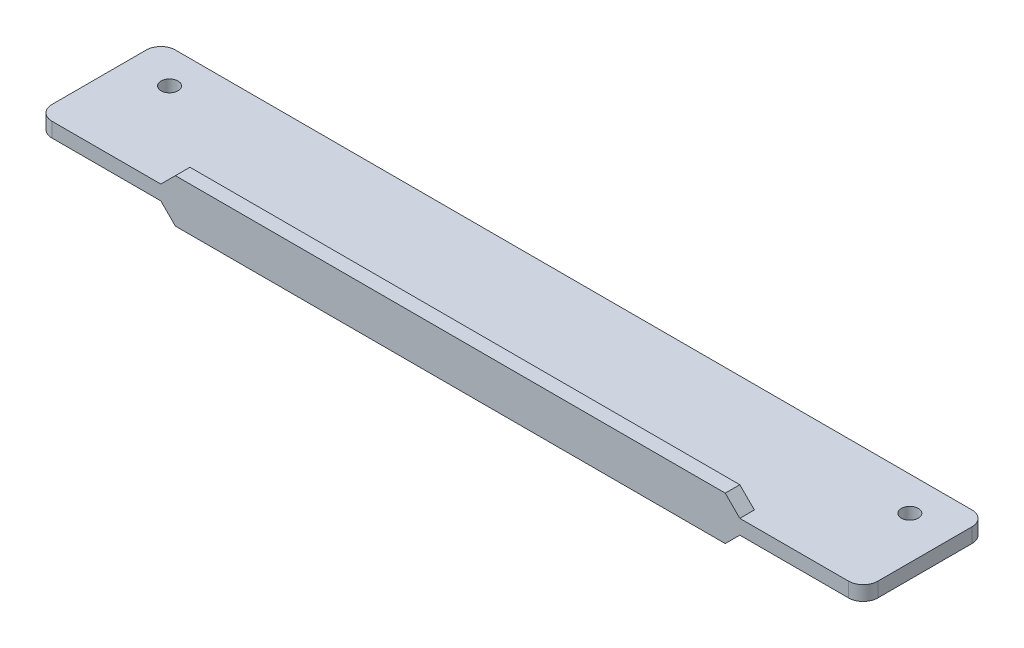
ISO-10303-21;
HEADER;
FILE_DESCRIPTION(('STEP AP214'),'2;1');
FILE_NAME('part.step','',(''),(''),'','','');
FILE_SCHEMA(('AUTOMOTIVE_DESIGN { 1 0 10303 214 1 1 1 1 }'));
ENDSEC;
DATA;
#1=APPLICATION_CONTEXT('core data for automotive mechanical design processes');
#2=APPLICATION_PROTOCOL_DEFINITION('international standard','automotive_design',2000,#1);
#3=PRODUCT_CONTEXT('',#1,'mechanical');
#4=PRODUCT('Part','Part','',(#3));
#5=PRODUCT_RELATED_PRODUCT_CATEGORY('part','',(#4));
#6=PRODUCT_DEFINITION_FORMATION('','',#4);
#7=PRODUCT_DEFINITION_CONTEXT('part definition',#1,'design');
#8=PRODUCT_DEFINITION('design','',#6,#7);
#9=PRODUCT_DEFINITION_SHAPE('','',#8);
#10=(LENGTH_UNIT() NAMED_UNIT(*) SI_UNIT(.MILLI.,.METRE.));
#11=(NAMED_UNIT(*) PLANE_ANGLE_UNIT() SI_UNIT($,.RADIAN.));
#12=(NAMED_UNIT(*) SI_UNIT($,.STERADIAN.) SOLID_ANGLE_UNIT());
#13=UNCERTAINTY_MEASURE_WITH_UNIT(LENGTH_MEASURE(1.E-05),#10,'distance_accuracy_value','');
#14=(GEOMETRIC_REPRESENTATION_CONTEXT(3) GLOBAL_UNCERTAINTY_ASSIGNED_CONTEXT((#13)) GLOBAL_UNIT_ASSIGNED_CONTEXT((#10,
#11,#12)) REPRESENTATION_CONTEXT('',''));
#15=CARTESIAN_POINT('',(0.,0.,0.));
#16=DIRECTION('',(0.,0.,1.));
#17=DIRECTION('',(1.,0.,0.));
#18=AXIS2_PLACEMENT_3D('',#15,#16,#17);
#19=CARTESIAN_POINT('',(-74.9462365591398,3.,-20.7168458781362));
#20=DIRECTION('',(1.,0.,0.));
#21=DIRECTION('',(0.,0.,-1.));
#22=AXIS2_PLACEMENT_3D('',#19,#20,#21);
#23=PLANE('',#22);
#24=DIRECTION('',(0.,0.,1.));
#25=VECTOR('',#24,1.);
#26=CARTESIAN_POINT('',(-74.9462365591398,3.,-20.7168458781362));
#27=LINE('',#26,#25);
#28=CARTESIAN_POINT('',(-74.9462365591398,3.,-17.7168458781362));
#29=VERTEX_POINT('',#28);
#30=CARTESIAN_POINT('',(-74.9462365591398,3.,1.6831541218638));
#31=VERTEX_POINT('',#30);
#32=EDGE_CURVE('E188',#29,#31,#27,.T.);
#33=ORIENTED_EDGE('',*,*,#32,.F.);
#34=DIRECTION('',(0.,-1.,0.));
#35=VECTOR('',#34,1.);
#36=CARTESIAN_POINT('',(-74.9462365591398,3.,-17.7168458781362));
#37=LINE('',#36,#35);
#38=CARTESIAN_POINT('',(-74.9462365591398,0.,-17.7168458781362));
#39=VERTEX_POINT('',#38);
#40=EDGE_CURVE('E223',#29,#39,#37,.T.);
#41=ORIENTED_EDGE('',*,*,#40,.T.);
#42=DIRECTION('',(0.,0.,1.));
#43=VECTOR('',#42,1.);
#44=CARTESIAN_POINT('',(-74.9462365591398,0.,-20.7168458781362));
#45=LINE('',#44,#43);
#46=CARTESIAN_POINT('',(-74.9462365591398,0.,1.6831541218638));
#47=VERTEX_POINT('',#46);
#48=EDGE_CURVE('E182',#39,#47,#45,.T.);
#49=ORIENTED_EDGE('',*,*,#48,.T.);
#50=DIRECTION('',(0.,-1.,0.));
#51=VECTOR('',#50,1.);
#52=CARTESIAN_POINT('',(-74.9462365591398,3.,1.6831541218638));
#53=LINE('',#52,#51);
#54=EDGE_CURVE('E221',#47,#31,#53,.F.);
#55=ORIENTED_EDGE('',*,*,#54,.T.);
#56=EDGE_LOOP('',(#33,#41,#49,#55));
#57=FACE_BOUND('',#56,.T.);
#58=ADVANCED_FACE('F35',(#57),#23,.F.);
#59=CARTESIAN_POINT('',(-74.9462365591398,3.,4.6831541218638));
#60=DIRECTION('',(0.,0.,-1.));
#61=DIRECTION('',(-1.,0.,0.));
#62=AXIS2_PLACEMENT_3D('',#59,#60,#61);
#63=PLANE('',#62);
#64=DIRECTION('',(1.,0.,0.));
#65=VECTOR('',#64,1.);
#66=CARTESIAN_POINT('',(-74.9462365591398,0.,4.6831541218638));
#67=LINE('',#66,#65);
#68=CARTESIAN_POINT('',(-71.9462365591398,0.,4.6831541218638));
#69=VERTEX_POINT('',#68);
#70=CARTESIAN_POINT('',(-49.5462365591398,0.,4.6831541218638));
#71=VERTEX_POINT('',#70);
#72=EDGE_CURVE('E165',#69,#71,#67,.T.);
#73=ORIENTED_EDGE('',*,*,#72,.T.);
#74=DIRECTION('',(-0.707106781186549,0.707106781186546,0.));
#75=VECTOR('',#74,1.);
#76=CARTESIAN_POINT('',(-49.5462365591398,0.,4.6831541218638));
#77=LINE('',#76,#75);
#78=CARTESIAN_POINT('',(-46.5462365591398,-3.,4.6831541218638));
#79=VERTEX_POINT('',#78);
#80=EDGE_CURVE('E148',#71,#79,#77,.F.);
#81=ORIENTED_EDGE('',*,*,#80,.T.);
#82=DIRECTION('',(1.,0.,0.));
#83=VECTOR('',#82,1.);
#84=CARTESIAN_POINT('',(-49.5462365591398,-3.,4.6831541218638));
#85=LINE('',#84,#83);
#86=CARTESIAN_POINT('',(66.6537634408602,-3.,4.6831541218638));
#87=VERTEX_POINT('',#86);
#88=EDGE_CURVE('E251',#79,#87,#85,.T.);
#89=ORIENTED_EDGE('',*,*,#88,.T.);
#90=DIRECTION('',(-0.707106781186546,-0.707106781186549,0.));
#91=VECTOR('',#90,1.);
#92=CARTESIAN_POINT('',(66.6537634408602,-3.,4.6831541218638));
#93=LINE('',#92,#91);
#94=CARTESIAN_POINT('',(69.6537634408602,0.,4.6831541218638));
#95=VERTEX_POINT('',#94);
#96=EDGE_CURVE('E159',#87,#95,#93,.F.);
#97=ORIENTED_EDGE('',*,*,#96,.T.);
#98=CARTESIAN_POINT('',(92.0537634408602,0.,4.6831541218638));
#99=VERTEX_POINT('',#98);
#100=EDGE_CURVE('E177',#95,#99,#67,.T.);
#101=ORIENTED_EDGE('',*,*,#100,.T.);
#102=DIRECTION('',(0.,-1.,0.));
#103=VECTOR('',#102,1.);
#104=CARTESIAN_POINT('',(92.0537634408602,3.,4.6831541218638));
#105=LINE('',#104,#103);
#106=CARTESIAN_POINT('',(92.0537634408602,3.,4.6831541218638));
#107=VERTEX_POINT('',#106);
#108=EDGE_CURVE('E218',#99,#107,#105,.F.);
#109=ORIENTED_EDGE('',*,*,#108,.T.);
#110=DIRECTION('',(1.,0.,0.));
#111=VECTOR('',#110,1.);
#112=CARTESIAN_POINT('',(-74.9462365591398,3.,4.6831541218638));
#113=LINE('',#112,#111);
#114=CARTESIAN_POINT('',(69.6537634408602,3.,4.6831541218638));
#115=VERTEX_POINT('',#114);
#116=EDGE_CURVE('E281',#115,#107,#113,.T.);
#117=ORIENTED_EDGE('',*,*,#116,.F.);
#118=DIRECTION('',(0.707106781186551,-0.707106781186544,0.));
#119=VECTOR('',#118,1.);
#120=CARTESIAN_POINT('',(69.6537634408602,3.,4.6831541218638));
#121=LINE('',#120,#119);
#122=CARTESIAN_POINT('',(66.6537634408602,6.,4.6831541218638));
#123=VERTEX_POINT('',#122);
#124=EDGE_CURVE('E229',#115,#123,#121,.F.);
#125=ORIENTED_EDGE('',*,*,#124,.T.);
#126=DIRECTION('',(-1.,0.,0.));
#127=VECTOR('',#126,1.);
#128=CARTESIAN_POINT('',(-49.5462365591398,6.,4.6831541218638));
#129=LINE('',#128,#127);
#130=CARTESIAN_POINT('',(-46.5462365591398,6.,4.6831541218638));
#131=VERTEX_POINT('',#130);
#132=EDGE_CURVE('E245',#123,#131,#129,.T.);
#133=ORIENTED_EDGE('',*,*,#132,.T.);
#134=DIRECTION('',(0.707106781186546,0.707106781186549,0.));
#135=VECTOR('',#134,1.);
#136=CARTESIAN_POINT('',(-46.5462365591398,6.,4.6831541218638));
#137=LINE('',#136,#135);
#138=CARTESIAN_POINT('',(-49.5462365591398,3.,4.6831541218638));
#139=VERTEX_POINT('',#138);
#140=EDGE_CURVE('E168',#131,#139,#137,.F.);
#141=ORIENTED_EDGE('',*,*,#140,.T.);
#142=CARTESIAN_POINT('',(-71.9462365591398,3.,4.6831541218638));
#143=VERTEX_POINT('',#142);
#144=EDGE_CURVE('E282',#143,#139,#113,.T.);
#145=ORIENTED_EDGE('',*,*,#144,.F.);
#146=DIRECTION('',(0.,-1.,0.));
#147=VECTOR('',#146,1.);
#148=CARTESIAN_POINT('',(-71.9462365591398,3.,4.6831541218638));
#149=LINE('',#148,#147);
#150=EDGE_CURVE('E175',#143,#69,#149,.T.);
#151=ORIENTED_EDGE('',*,*,#150,.T.);
#152=EDGE_LOOP('',(#73,#81,#89,#97,#101,#109,#117,#125,#133,#141,#145,#151));
#153=FACE_BOUND('',#152,.T.);
#154=ADVANCED_FACE('F172',(#153),#63,.F.);
#155=CARTESIAN_POINT('',(95.0537634408602,3.,-20.7168458781362));
#156=DIRECTION('',(-1.,0.,0.));
#157=DIRECTION('',(0.,0.,1.));
#158=AXIS2_PLACEMENT_3D('',#155,#156,#157);
#159=PLANE('',#158);
#160=DIRECTION('',(0.,0.,-1.));
#161=VECTOR('',#160,1.);
#162=CARTESIAN_POINT('',(95.0537634408602,0.,-20.7168458781362));
#163=LINE('',#162,#161);
#164=CARTESIAN_POINT('',(95.0537634408602,0.,1.68315412186381));
#165=VERTEX_POINT('',#164);
#166=CARTESIAN_POINT('',(95.0537634408602,0.,-17.7168458781362));
#167=VERTEX_POINT('',#166);
#168=EDGE_CURVE('E176',#165,#167,#163,.T.);
#169=ORIENTED_EDGE('',*,*,#168,.T.);
#170=DIRECTION('',(0.,-1.,0.));
#171=VECTOR('',#170,1.);
#172=CARTESIAN_POINT('',(95.0537634408602,3.,-17.7168458781362));
#173=LINE('',#172,#171);
#174=CARTESIAN_POINT('',(95.0537634408602,3.,-17.7168458781362));
#175=VERTEX_POINT('',#174);
#176=EDGE_CURVE('E207',#167,#175,#173,.F.);
#177=ORIENTED_EDGE('',*,*,#176,.T.);
#178=DIRECTION('',(0.,0.,-1.));
#179=VECTOR('',#178,1.);
#180=CARTESIAN_POINT('',(95.0537634408602,3.,-20.7168458781362));
#181=LINE('',#180,#179);
#182=CARTESIAN_POINT('',(95.0537634408602,3.,1.68315412186381));
#183=VERTEX_POINT('',#182);
#184=EDGE_CURVE('E284',#183,#175,#181,.T.);
#185=ORIENTED_EDGE('',*,*,#184,.F.);
#186=DIRECTION('',(0.,-1.,0.));
#187=VECTOR('',#186,1.);
#188=CARTESIAN_POINT('',(95.0537634408602,3.,1.68315412186381));
#189=LINE('',#188,#187);
#190=EDGE_CURVE('E204',#183,#165,#189,.T.);
#191=ORIENTED_EDGE('',*,*,#190,.T.);
#192=EDGE_LOOP('',(#169,#177,#185,#191));
#193=FACE_BOUND('',#192,.T.);
#194=ADVANCED_FACE('F320',(#193),#159,.F.);
#195=CARTESIAN_POINT('',(-74.9462365591398,3.,-20.7168458781362));
#196=DIRECTION('',(0.,0.,1.));
#197=DIRECTION('',(1.,0.,0.));
#198=AXIS2_PLACEMENT_3D('',#195,#196,#197);
#199=PLANE('',#198);
#200=DIRECTION('',(-1.,0.,0.));
#201=VECTOR('',#200,1.);
#202=CARTESIAN_POINT('',(-74.9462365591398,3.,-20.7168458781362));
#203=LINE('',#202,#201);
#204=CARTESIAN_POINT('',(92.0537634408602,3.,-20.7168458781362));
#205=VERTEX_POINT('',#204);
#206=CARTESIAN_POINT('',(-71.9462365591398,3.,-20.7168458781362));
#207=VERTEX_POINT('',#206);
#208=EDGE_CURVE('E192',#205,#207,#203,.T.);
#209=ORIENTED_EDGE('',*,*,#208,.F.);
#210=DIRECTION('',(0.,-1.,0.));
#211=VECTOR('',#210,1.);
#212=CARTESIAN_POINT('',(92.0537634408602,3.,-20.7168458781362));
#213=LINE('',#212,#211);
#214=CARTESIAN_POINT('',(92.0537634408602,0.,-20.7168458781362));
#215=VERTEX_POINT('',#214);
#216=EDGE_CURVE('E191',#205,#215,#213,.T.);
#217=ORIENTED_EDGE('',*,*,#216,.T.);
#218=DIRECTION('',(-1.,0.,0.));
#219=VECTOR('',#218,1.);
#220=CARTESIAN_POINT('',(-74.9462365591398,0.,-20.7168458781362));
#221=LINE('',#220,#219);
#222=CARTESIAN_POINT('',(-71.9462365591398,0.,-20.7168458781362));
#223=VERTEX_POINT('',#222);
#224=EDGE_CURVE('E180',#215,#223,#221,.T.);
#225=ORIENTED_EDGE('',*,*,#224,.T.);
#226=DIRECTION('',(0.,-1.,0.));
#227=VECTOR('',#226,1.);
#228=CARTESIAN_POINT('',(-71.9462365591398,3.,-20.7168458781362));
#229=LINE('',#228,#227);
#230=EDGE_CURVE('E189',#223,#207,#229,.F.);
#231=ORIENTED_EDGE('',*,*,#230,.T.);
#232=EDGE_LOOP('',(#209,#217,#225,#231));
#233=FACE_BOUND('',#232,.T.);
#234=ADVANCED_FACE('F382',(#233),#199,.F.);
#235=CARTESIAN_POINT('',(0.,3.,0.));
#236=DIRECTION('',(0.,1.,0.));
#237=DIRECTION('',(0.,0.,1.));
#238=AXIS2_PLACEMENT_3D('',#235,#236,#237);
#239=PLANE('',#238);
#240=DIRECTION('',(0.,0.,1.));
#241=VECTOR('',#240,1.);
#242=CARTESIAN_POINT('',(-49.5462365591398,3.,0.));
#243=LINE('',#242,#241);
#244=CARTESIAN_POINT('',(-49.5462365591398,3.,1.6831541218638));
#245=VERTEX_POINT('',#244);
#246=EDGE_CURVE('E264',#245,#139,#243,.T.);
#247=ORIENTED_EDGE('',*,*,#246,.F.);
#248=DIRECTION('',(1.,0.,0.));
#249=VECTOR('',#248,1.);
#250=CARTESIAN_POINT('',(0.,3.,1.6831541218638));
#251=LINE('',#250,#249);
#252=CARTESIAN_POINT('',(69.6537634408602,3.,1.6831541218638));
#253=VERTEX_POINT('',#252);
#254=EDGE_CURVE('E258',#245,#253,#251,.T.);
#255=ORIENTED_EDGE('',*,*,#254,.T.);
#256=DIRECTION('',(0.,0.,-1.));
#257=VECTOR('',#256,1.);
#258=CARTESIAN_POINT('',(69.6537634408602,3.,0.));
#259=LINE('',#258,#257);
#260=EDGE_CURVE('E261',#115,#253,#259,.T.);
#261=ORIENTED_EDGE('',*,*,#260,.F.);
#262=ORIENTED_EDGE('',*,*,#116,.T.);
#263=CARTESIAN_POINT('',(92.0537634408602,3.,1.6831541218638));
#264=DIRECTION('',(0.,1.,0.));
#265=DIRECTION('',(0.,0.,1.));
#266=AXIS2_PLACEMENT_3D('',#263,#264,#265);
#267=CIRCLE('',#266,3.);
#268=EDGE_CURVE('E213',#107,#183,#267,.T.);
#269=ORIENTED_EDGE('',*,*,#268,.T.);
#270=ORIENTED_EDGE('',*,*,#184,.T.);
#271=CARTESIAN_POINT('',(92.0537634408602,3.,-17.7168458781362));
#272=DIRECTION('',(0.,1.,0.));
#273=DIRECTION('',(0.,0.,1.));
#274=AXIS2_PLACEMENT_3D('',#271,#272,#273);
#275=CIRCLE('',#274,3.);
#276=EDGE_CURVE('E215',#175,#205,#275,.T.);
#277=ORIENTED_EDGE('',*,*,#276,.T.);
#278=ORIENTED_EDGE('',*,*,#208,.T.);
#279=CARTESIAN_POINT('',(-71.9462365591398,3.,-17.7168458781362));
#280=DIRECTION('',(0.,1.,0.));
#281=DIRECTION('',(0.,0.,1.));
#282=AXIS2_PLACEMENT_3D('',#279,#280,#281);
#283=CIRCLE('',#282,3.);
#284=EDGE_CURVE('E211',#207,#29,#283,.T.);
#285=ORIENTED_EDGE('',*,*,#284,.T.);
#286=ORIENTED_EDGE('',*,*,#32,.T.);
#287=CARTESIAN_POINT('',(-71.9462365591398,3.,1.6831541218638));
#288=DIRECTION('',(0.,1.,0.));
#289=DIRECTION('',(0.,0.,1.));
#290=AXIS2_PLACEMENT_3D('',#287,#288,#289);
#291=CIRCLE('',#290,3.);
#292=EDGE_CURVE('E209',#31,#143,#291,.T.);
#293=ORIENTED_EDGE('',*,*,#292,.T.);
#294=ORIENTED_EDGE('',*,*,#144,.T.);
#295=EDGE_LOOP('',(#247,#255,#261,#262,#269,#270,#277,#278,#285,#286,#293,#294));
#296=FACE_BOUND('',#295,.T.);
#297=CARTESIAN_POINT('',(-66.1462365591398,3.,-13.7168458781362));
#298=DIRECTION('',(0.,1.,0.));
#299=DIRECTION('',(0.,0.,1.));
#300=AXIS2_PLACEMENT_3D('',#297,#298,#299);
#301=CIRCLE('',#300,1.75);
#302=CARTESIAN_POINT('',(-66.1462365591398,3.,-11.9668458781362));
#303=VERTEX_POINT('',#302);
#304=EDGE_CURVE('E267',#303,#303,#301,.T.);
#305=ORIENTED_EDGE('',*,*,#304,.F.);
#306=EDGE_LOOP('',(#305));
#307=FACE_BOUND('',#306,.T.);
#308=CARTESIAN_POINT('',(86.2537634408602,3.,-13.7168458781362));
#309=DIRECTION('',(0.,1.,0.));
#310=DIRECTION('',(0.,0.,1.));
#311=AXIS2_PLACEMENT_3D('',#308,#309,#310);
#312=CIRCLE('',#311,1.75);
#313=CARTESIAN_POINT('',(86.2537634408602,3.,-11.9668458781362));
#314=VERTEX_POINT('',#313);
#315=EDGE_CURVE('E271',#314,#314,#312,.T.);
#316=ORIENTED_EDGE('',*,*,#315,.F.);
#317=EDGE_LOOP('',(#316));
#318=FACE_BOUND('',#317,.T.);
#319=ADVANCED_FACE('F290',(#296,#307,#318),#239,.T.);
#320=CARTESIAN_POINT('',(0.,0.,0.));
#321=DIRECTION('',(0.,1.,0.));
#322=DIRECTION('',(0.,0.,1.));
#323=AXIS2_PLACEMENT_3D('',#320,#321,#322);
#324=PLANE('',#323);
#325=CARTESIAN_POINT('',(-66.1462365591398,0.,-13.7168458781362));
#326=DIRECTION('',(0.,1.,0.));
#327=DIRECTION('',(0.,0.,1.));
#328=AXIS2_PLACEMENT_3D('',#325,#326,#327);
#329=CIRCLE('',#328,1.75);
#330=CARTESIAN_POINT('',(-66.1462365591398,0.,-11.9668458781362));
#331=VERTEX_POINT('',#330);
#332=EDGE_CURVE('E268',#331,#331,#329,.T.);
#333=ORIENTED_EDGE('',*,*,#332,.T.);
#334=EDGE_LOOP('',(#333));
#335=FACE_BOUND('',#334,.T.);
#336=CARTESIAN_POINT('',(86.2537634408602,0.,-13.7168458781362));
#337=DIRECTION('',(0.,1.,0.));
#338=DIRECTION('',(0.,0.,1.));
#339=AXIS2_PLACEMENT_3D('',#336,#337,#338);
#340=CIRCLE('',#339,1.75);
#341=CARTESIAN_POINT('',(86.2537634408602,0.,-11.9668458781362));
#342=VERTEX_POINT('',#341);
#343=EDGE_CURVE('E274',#342,#342,#340,.T.);
#344=ORIENTED_EDGE('',*,*,#343,.T.);
#345=EDGE_LOOP('',(#344));
#346=FACE_BOUND('',#345,.T.);
#347=DIRECTION('',(1.,0.,0.));
#348=VECTOR('',#347,1.);
#349=CARTESIAN_POINT('',(0.,0.,1.6831541218638));
#350=LINE('',#349,#348);
#351=CARTESIAN_POINT('',(-49.5462365591398,0.,1.6831541218638));
#352=VERTEX_POINT('',#351);
#353=CARTESIAN_POINT('',(69.6537634408602,0.,1.6831541218638));
#354=VERTEX_POINT('',#353);
#355=EDGE_CURVE('E167',#352,#354,#350,.T.);
#356=ORIENTED_EDGE('',*,*,#355,.F.);
#357=DIRECTION('',(0.,0.,1.));
#358=VECTOR('',#357,1.);
#359=CARTESIAN_POINT('',(-49.5462365591398,0.,0.));
#360=LINE('',#359,#358);
#361=EDGE_CURVE('E152',#352,#71,#360,.T.);
#362=ORIENTED_EDGE('',*,*,#361,.T.);
#363=ORIENTED_EDGE('',*,*,#72,.F.);
#364=CARTESIAN_POINT('',(-71.9462365591398,0.,1.6831541218638));
#365=DIRECTION('',(0.,1.,0.));
#366=DIRECTION('',(0.,0.,1.));
#367=AXIS2_PLACEMENT_3D('',#364,#365,#366);
#368=CIRCLE('',#367,3.);
#369=EDGE_CURVE('E195',#69,#47,#368,.F.);
#370=ORIENTED_EDGE('',*,*,#369,.T.);
#371=ORIENTED_EDGE('',*,*,#48,.F.);
#372=CARTESIAN_POINT('',(-71.9462365591398,0.,-17.7168458781362));
#373=DIRECTION('',(0.,1.,0.));
#374=DIRECTION('',(0.,0.,1.));
#375=AXIS2_PLACEMENT_3D('',#372,#373,#374);
#376=CIRCLE('',#375,3.);
#377=EDGE_CURVE('E197',#39,#223,#376,.F.);
#378=ORIENTED_EDGE('',*,*,#377,.T.);
#379=ORIENTED_EDGE('',*,*,#224,.F.);
#380=CARTESIAN_POINT('',(92.0537634408602,0.,-17.7168458781362));
#381=DIRECTION('',(0.,1.,0.));
#382=DIRECTION('',(0.,0.,1.));
#383=AXIS2_PLACEMENT_3D('',#380,#381,#382);
#384=CIRCLE('',#383,3.);
#385=EDGE_CURVE('E202',#215,#167,#384,.F.);
#386=ORIENTED_EDGE('',*,*,#385,.T.);
#387=ORIENTED_EDGE('',*,*,#168,.F.);
#388=CARTESIAN_POINT('',(92.0537634408602,0.,1.6831541218638));
#389=DIRECTION('',(0.,1.,0.));
#390=DIRECTION('',(0.,0.,1.));
#391=AXIS2_PLACEMENT_3D('',#388,#389,#390);
#392=CIRCLE('',#391,3.);
#393=EDGE_CURVE('E199',#165,#99,#392,.F.);
#394=ORIENTED_EDGE('',*,*,#393,.T.);
#395=ORIENTED_EDGE('',*,*,#100,.F.);
#396=DIRECTION('',(0.,0.,-1.));
#397=VECTOR('',#396,1.);
#398=CARTESIAN_POINT('',(69.6537634408602,0.,0.));
#399=LINE('',#398,#397);
#400=EDGE_CURVE('E169',#95,#354,#399,.T.);
#401=ORIENTED_EDGE('',*,*,#400,.T.);
#402=EDGE_LOOP('',(#356,#362,#363,#370,#371,#378,#379,#386,#387,#394,#395,#401));
#403=FACE_BOUND('',#402,.T.);
#404=ADVANCED_FACE('F164',(#335,#346,#403),#324,.F.);
#405=CARTESIAN_POINT('',(92.0537634408602,3.,-17.7168458781362));
#406=DIRECTION('',(0.,-1.,0.));
#407=DIRECTION('',(0.,0.,-1.));
#408=AXIS2_PLACEMENT_3D('',#405,#406,#407);
#409=CYLINDRICAL_SURFACE('',#408,3.);
#410=ORIENTED_EDGE('',*,*,#276,.F.);
#411=ORIENTED_EDGE('',*,*,#176,.F.);
#412=ORIENTED_EDGE('',*,*,#385,.F.);
#413=ORIENTED_EDGE('',*,*,#216,.F.);
#414=EDGE_LOOP('',(#410,#411,#412,#413));
#415=FACE_BOUND('',#414,.T.);
#416=ADVANCED_FACE('F324',(#415),#409,.T.);
#417=CARTESIAN_POINT('',(92.0537634408602,3.,1.6831541218638));
#418=DIRECTION('',(0.,-1.,0.));
#419=DIRECTION('',(0.,0.,-1.));
#420=AXIS2_PLACEMENT_3D('',#417,#418,#419);
#421=CYLINDRICAL_SURFACE('',#420,3.);
#422=ORIENTED_EDGE('',*,*,#268,.F.);
#423=ORIENTED_EDGE('',*,*,#108,.F.);
#424=ORIENTED_EDGE('',*,*,#393,.F.);
#425=ORIENTED_EDGE('',*,*,#190,.F.);
#426=EDGE_LOOP('',(#422,#423,#424,#425));
#427=FACE_BOUND('',#426,.T.);
#428=ADVANCED_FACE('F327',(#427),#421,.T.);
#429=CARTESIAN_POINT('',(-71.9462365591398,3.,-17.7168458781362));
#430=DIRECTION('',(0.,-1.,0.));
#431=DIRECTION('',(0.,0.,-1.));
#432=AXIS2_PLACEMENT_3D('',#429,#430,#431);
#433=CYLINDRICAL_SURFACE('',#432,3.);
#434=ORIENTED_EDGE('',*,*,#284,.F.);
#435=ORIENTED_EDGE('',*,*,#230,.F.);
#436=ORIENTED_EDGE('',*,*,#377,.F.);
#437=ORIENTED_EDGE('',*,*,#40,.F.);
#438=EDGE_LOOP('',(#434,#435,#436,#437));
#439=FACE_BOUND('',#438,.T.);
#440=ADVANCED_FACE('F299',(#439),#433,.T.);
#441=CARTESIAN_POINT('',(-71.9462365591398,3.,1.6831541218638));
#442=DIRECTION('',(0.,-1.,0.));
#443=DIRECTION('',(0.,0.,-1.));
#444=AXIS2_PLACEMENT_3D('',#441,#442,#443);
#445=CYLINDRICAL_SURFACE('',#444,3.);
#446=ORIENTED_EDGE('',*,*,#292,.F.);
#447=ORIENTED_EDGE('',*,*,#54,.F.);
#448=ORIENTED_EDGE('',*,*,#369,.F.);
#449=ORIENTED_EDGE('',*,*,#150,.F.);
#450=EDGE_LOOP('',(#446,#447,#448,#449));
#451=FACE_BOUND('',#450,.T.);
#452=ADVANCED_FACE('F307',(#451),#445,.T.);
#453=CARTESIAN_POINT('',(86.2537634408602,0.,-13.7168458781362));
#454=DIRECTION('',(0.,1.,0.));
#455=DIRECTION('',(0.,0.,1.));
#456=AXIS2_PLACEMENT_3D('',#453,#454,#455);
#457=CYLINDRICAL_SURFACE('',#456,1.75);
#458=ORIENTED_EDGE('',*,*,#343,.F.);
#459=EDGE_LOOP('',(#458));
#460=FACE_BOUND('',#459,.T.);
#461=ORIENTED_EDGE('',*,*,#315,.T.);
#462=EDGE_LOOP('',(#461));
#463=FACE_BOUND('',#462,.T.);
#464=ADVANCED_FACE('F336',(#460,#463),#457,.F.);
#465=CARTESIAN_POINT('',(-66.1462365591398,0.,-13.7168458781362));
#466=DIRECTION('',(0.,1.,0.));
#467=DIRECTION('',(0.,0.,1.));
#468=AXIS2_PLACEMENT_3D('',#465,#466,#467);
#469=CYLINDRICAL_SURFACE('',#468,1.75);
#470=ORIENTED_EDGE('',*,*,#332,.F.);
#471=EDGE_LOOP('',(#470));
#472=FACE_BOUND('',#471,.T.);
#473=ORIENTED_EDGE('',*,*,#304,.T.);
#474=EDGE_LOOP('',(#473));
#475=FACE_BOUND('',#474,.T.);
#476=ADVANCED_FACE('F369',(#472,#475),#469,.F.);
#477=CARTESIAN_POINT('',(-49.5462365591398,-3.,1.6831541218638));
#478=DIRECTION('',(0.,-1.,0.));
#479=DIRECTION('',(0.,0.,-1.));
#480=AXIS2_PLACEMENT_3D('',#477,#478,#479);
#481=PLANE('',#480);
#482=ORIENTED_EDGE('',*,*,#88,.F.);
#483=DIRECTION('',(0.,0.,-1.));
#484=VECTOR('',#483,1.);
#485=CARTESIAN_POINT('',(-46.5462365591398,-3.,1.6831541218638));
#486=LINE('',#485,#484);
#487=CARTESIAN_POINT('',(-46.5462365591398,-3.,1.6831541218638));
#488=VERTEX_POINT('',#487);
#489=EDGE_CURVE('E153',#79,#488,#486,.T.);
#490=ORIENTED_EDGE('',*,*,#489,.T.);
#491=DIRECTION('',(1.,0.,0.));
#492=VECTOR('',#491,1.);
#493=CARTESIAN_POINT('',(-49.5462365591398,-3.,1.6831541218638));
#494=LINE('',#493,#492);
#495=CARTESIAN_POINT('',(66.6537634408602,-3.,1.6831541218638));
#496=VERTEX_POINT('',#495);
#497=EDGE_CURVE('E250',#488,#496,#494,.T.);
#498=ORIENTED_EDGE('',*,*,#497,.T.);
#499=DIRECTION('',(0.,0.,1.));
#500=VECTOR('',#499,1.);
#501=CARTESIAN_POINT('',(66.6537634408602,-3.,1.6831541218638));
#502=LINE('',#501,#500);
#503=EDGE_CURVE('E158',#496,#87,#502,.T.);
#504=ORIENTED_EDGE('',*,*,#503,.T.);
#505=EDGE_LOOP('',(#482,#490,#498,#504));
#506=FACE_BOUND('',#505,.T.);
#507=ADVANCED_FACE('F351',(#506),#481,.T.);
#508=CARTESIAN_POINT('',(0.,0.,1.6831541218638));
#509=DIRECTION('',(0.,0.,1.));
#510=DIRECTION('',(1.,0.,0.));
#511=AXIS2_PLACEMENT_3D('',#508,#509,#510);
#512=PLANE('',#511);
#513=ORIENTED_EDGE('',*,*,#497,.F.);
#514=DIRECTION('',(0.707106781186549,-0.707106781186546,0.));
#515=VECTOR('',#514,1.);
#516=CARTESIAN_POINT('',(-49.5462365591398,0.,1.6831541218638));
#517=LINE('',#516,#515);
#518=EDGE_CURVE('E237',#488,#352,#517,.F.);
#519=ORIENTED_EDGE('',*,*,#518,.T.);
#520=ORIENTED_EDGE('',*,*,#355,.T.);
#521=DIRECTION('',(0.707106781186546,0.707106781186549,0.));
#522=VECTOR('',#521,1.);
#523=CARTESIAN_POINT('',(66.6537634408602,-3.,1.6831541218638));
#524=LINE('',#523,#522);
#525=EDGE_CURVE('E235',#354,#496,#524,.F.);
#526=ORIENTED_EDGE('',*,*,#525,.T.);
#527=EDGE_LOOP('',(#513,#519,#520,#526));
#528=FACE_BOUND('',#527,.T.);
#529=ADVANCED_FACE('F349',(#528),#512,.F.);
#530=CARTESIAN_POINT('',(-49.5462365591398,6.,1.6831541218638));
#531=DIRECTION('',(0.,1.,0.));
#532=DIRECTION('',(0.,0.,1.));
#533=AXIS2_PLACEMENT_3D('',#530,#531,#532);
#534=PLANE('',#533);
#535=ORIENTED_EDGE('',*,*,#132,.F.);
#536=DIRECTION('',(0.,0.,-1.));
#537=VECTOR('',#536,1.);
#538=CARTESIAN_POINT('',(66.6537634408602,6.,1.6831541218638));
#539=LINE('',#538,#537);
#540=CARTESIAN_POINT('',(66.6537634408602,6.,1.6831541218638));
#541=VERTEX_POINT('',#540);
#542=EDGE_CURVE('E56',#123,#541,#539,.T.);
#543=ORIENTED_EDGE('',*,*,#542,.T.);
#544=DIRECTION('',(-1.,0.,0.));
#545=VECTOR('',#544,1.);
#546=CARTESIAN_POINT('',(-49.5462365591398,6.,1.6831541218638));
#547=LINE('',#546,#545);
#548=CARTESIAN_POINT('',(-46.5462365591398,6.,1.6831541218638));
#549=VERTEX_POINT('',#548);
#550=EDGE_CURVE('E246',#541,#549,#547,.T.);
#551=ORIENTED_EDGE('',*,*,#550,.T.);
#552=DIRECTION('',(0.,0.,1.));
#553=VECTOR('',#552,1.);
#554=CARTESIAN_POINT('',(-46.5462365591398,6.,1.6831541218638));
#555=LINE('',#554,#553);
#556=EDGE_CURVE('E239',#549,#131,#555,.T.);
#557=ORIENTED_EDGE('',*,*,#556,.T.);
#558=EDGE_LOOP('',(#535,#543,#551,#557));
#559=FACE_BOUND('',#558,.T.);
#560=ADVANCED_FACE('F244',(#559),#534,.T.);
#561=ORIENTED_EDGE('',*,*,#550,.F.);
#562=DIRECTION('',(-0.707106781186551,0.707106781186544,0.));
#563=VECTOR('',#562,1.);
#564=CARTESIAN_POINT('',(69.6537634408602,3.,1.6831541218638));
#565=LINE('',#564,#563);
#566=EDGE_CURVE('E11',#541,#253,#565,.F.);
#567=ORIENTED_EDGE('',*,*,#566,.T.);
#568=ORIENTED_EDGE('',*,*,#254,.F.);
#569=DIRECTION('',(-0.707106781186546,-0.707106781186549,0.));
#570=VECTOR('',#569,1.);
#571=CARTESIAN_POINT('',(-46.5462365591398,6.,1.6831541218638));
#572=LINE('',#571,#570);
#573=EDGE_CURVE('E43',#245,#549,#572,.F.);
#574=ORIENTED_EDGE('',*,*,#573,.T.);
#575=EDGE_LOOP('',(#561,#567,#568,#574));
#576=FACE_BOUND('',#575,.T.);
#577=ADVANCED_FACE('F339',(#576),#512,.F.);
#578=CARTESIAN_POINT('',(-49.5462365591398,0.,1.6831541218638));
#579=DIRECTION('',(0.707106781186546,0.707106781186549,0.));
#580=DIRECTION('',(0.,0.,1.));
#581=AXIS2_PLACEMENT_3D('',#578,#579,#580);
#582=PLANE('',#581);
#583=ORIENTED_EDGE('',*,*,#518,.F.);
#584=ORIENTED_EDGE('',*,*,#489,.F.);
#585=ORIENTED_EDGE('',*,*,#80,.F.);
#586=ORIENTED_EDGE('',*,*,#361,.F.);
#587=EDGE_LOOP('',(#583,#584,#585,#586));
#588=FACE_BOUND('',#587,.T.);
#589=ADVANCED_FACE('F151',(#588),#582,.F.);
#590=CARTESIAN_POINT('',(66.6537634408602,-3.,1.6831541218638));
#591=DIRECTION('',(-0.707106781186549,0.707106781186546,0.));
#592=DIRECTION('',(0.,0.,1.));
#593=AXIS2_PLACEMENT_3D('',#590,#591,#592);
#594=PLANE('',#593);
#595=ORIENTED_EDGE('',*,*,#525,.F.);
#596=ORIENTED_EDGE('',*,*,#400,.F.);
#597=ORIENTED_EDGE('',*,*,#96,.F.);
#598=ORIENTED_EDGE('',*,*,#503,.F.);
#599=EDGE_LOOP('',(#595,#596,#597,#598));
#600=FACE_BOUND('',#599,.T.);
#601=ADVANCED_FACE('F313',(#600),#594,.F.);
#602=CARTESIAN_POINT('',(69.6537634408602,3.,1.6831541218638));
#603=DIRECTION('',(-0.707106781186544,-0.707106781186551,0.));
#604=DIRECTION('',(0.,0.,1.));
#605=AXIS2_PLACEMENT_3D('',#602,#603,#604);
#606=PLANE('',#605);
#607=ORIENTED_EDGE('',*,*,#566,.F.);
#608=ORIENTED_EDGE('',*,*,#542,.F.);
#609=ORIENTED_EDGE('',*,*,#124,.F.);
#610=ORIENTED_EDGE('',*,*,#260,.T.);
#611=EDGE_LOOP('',(#607,#608,#609,#610));
#612=FACE_BOUND('',#611,.T.);
#613=ADVANCED_FACE('F309',(#612),#606,.F.);
#614=CARTESIAN_POINT('',(-46.5462365591398,6.,1.6831541218638));
#615=DIRECTION('',(0.707106781186549,-0.707106781186546,0.));
#616=DIRECTION('',(0.,0.,1.));
#617=AXIS2_PLACEMENT_3D('',#614,#615,#616);
#618=PLANE('',#617);
#619=ORIENTED_EDGE('',*,*,#573,.F.);
#620=ORIENTED_EDGE('',*,*,#246,.T.);
#621=ORIENTED_EDGE('',*,*,#140,.F.);
#622=ORIENTED_EDGE('',*,*,#556,.F.);
#623=EDGE_LOOP('',(#619,#620,#621,#622));
#624=FACE_BOUND('',#623,.T.);
#625=ADVANCED_FACE('F37',(#624),#618,.F.);
#626=CLOSED_SHELL('',(#58,#154,#194,#234,#319,#404,#416,#428,#440,#452,#464,#476,#507,#529,#560,
#577,#589,#601,#613,#625));
#627=MANIFOLD_SOLID_BREP('B2',#626);
#628=ADVANCED_BREP_SHAPE_REPRESENTATION('',(#18,#627),#14);
#629=SHAPE_DEFINITION_REPRESENTATION(#9,#628);
ENDSEC;
END-ISO-10303-21;
